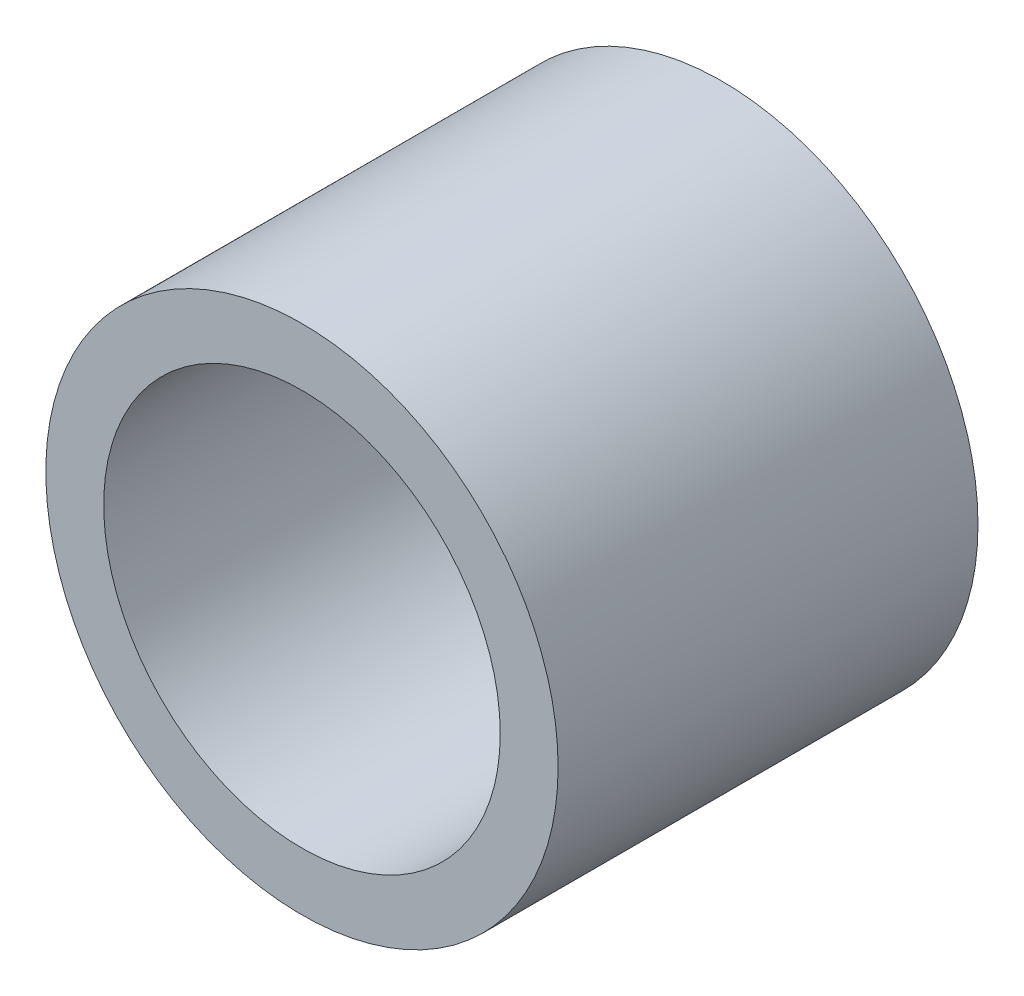
ISO-10303-21;
HEADER;
FILE_DESCRIPTION(('STEP AP214'),'2;1');
FILE_NAME('part.step','',(''),(''),'','','');
FILE_SCHEMA(('AUTOMOTIVE_DESIGN { 1 0 10303 214 1 1 1 1 }'));
ENDSEC;
DATA;
#1=APPLICATION_CONTEXT('core data for automotive mechanical design processes');
#2=APPLICATION_PROTOCOL_DEFINITION('international standard','automotive_design',2000,#1);
#3=PRODUCT_CONTEXT('',#1,'mechanical');
#4=PRODUCT('Part','Part','',(#3));
#5=PRODUCT_RELATED_PRODUCT_CATEGORY('part','',(#4));
#6=PRODUCT_DEFINITION_FORMATION('','',#4);
#7=PRODUCT_DEFINITION_CONTEXT('part definition',#1,'design');
#8=PRODUCT_DEFINITION('design','',#6,#7);
#9=PRODUCT_DEFINITION_SHAPE('','',#8);
#10=(LENGTH_UNIT() NAMED_UNIT(*) SI_UNIT(.MILLI.,.METRE.));
#11=(NAMED_UNIT(*) PLANE_ANGLE_UNIT() SI_UNIT($,.RADIAN.));
#12=(NAMED_UNIT(*) SI_UNIT($,.STERADIAN.) SOLID_ANGLE_UNIT());
#13=UNCERTAINTY_MEASURE_WITH_UNIT(LENGTH_MEASURE(1.E-05),#10,'distance_accuracy_value','');
#14=(GEOMETRIC_REPRESENTATION_CONTEXT(3) GLOBAL_UNCERTAINTY_ASSIGNED_CONTEXT((#13)) GLOBAL_UNIT_ASSIGNED_CONTEXT((#10,
#11,#12)) REPRESENTATION_CONTEXT('',''));
#15=CARTESIAN_POINT('',(0.,0.,0.));
#16=DIRECTION('',(0.,0.,1.));
#17=DIRECTION('',(1.,0.,0.));
#18=AXIS2_PLACEMENT_3D('',#15,#16,#17);
#19=CARTESIAN_POINT('',(-10.98,0.,0.));
#20=DIRECTION('',(0.,0.,-1.));
#21=DIRECTION('',(-1.,0.,0.));
#22=AXIS2_PLACEMENT_3D('',#19,#20,#21);
#23=PLANE('',#22);
#24=CARTESIAN_POINT('',(0.,0.,0.));
#25=DIRECTION('',(0.,0.,1.));
#26=DIRECTION('',(1.,0.,0.));
#27=AXIS2_PLACEMENT_3D('',#24,#25,#26);
#28=CIRCLE('',#27,8.5);
#29=CARTESIAN_POINT('',(8.5,0.,0.));
#30=VERTEX_POINT('',#29);
#31=EDGE_CURVE('E10',#30,#30,#28,.T.);
#32=ORIENTED_EDGE('',*,*,#31,.F.);
#33=EDGE_LOOP('',(#32));
#34=FACE_BOUND('',#33,.T.);
#35=CARTESIAN_POINT('',(0.,0.,0.));
#36=DIRECTION('',(0.,0.,1.));
#37=DIRECTION('',(1.,0.,0.));
#38=AXIS2_PLACEMENT_3D('',#35,#36,#37);
#39=CIRCLE('',#38,10.98);
#40=CARTESIAN_POINT('',(10.98,0.,0.));
#41=VERTEX_POINT('',#40);
#42=EDGE_CURVE('E60',#41,#41,#39,.T.);
#43=ORIENTED_EDGE('',*,*,#42,.T.);
#44=EDGE_LOOP('',(#43));
#45=FACE_BOUND('',#44,.T.);
#46=ADVANCED_FACE('F43',(#34,#45),#23,.F.);
#47=CARTESIAN_POINT('',(0.,0.,0.));
#48=DIRECTION('',(0.,0.,1.));
#49=DIRECTION('',(1.,0.,0.));
#50=AXIS2_PLACEMENT_3D('',#47,#48,#49);
#51=CYLINDRICAL_SURFACE('',#50,8.5);
#52=CARTESIAN_POINT('',(0.,0.,-18.));
#53=DIRECTION('',(0.,0.,1.));
#54=DIRECTION('',(1.,0.,0.));
#55=AXIS2_PLACEMENT_3D('',#52,#53,#54);
#56=CIRCLE('',#55,8.5);
#57=CARTESIAN_POINT('',(8.5,0.,-18.));
#58=VERTEX_POINT('',#57);
#59=EDGE_CURVE('E50',#58,#58,#56,.T.);
#60=ORIENTED_EDGE('',*,*,#59,.F.);
#61=EDGE_LOOP('',(#60));
#62=FACE_BOUND('',#61,.T.);
#63=ORIENTED_EDGE('',*,*,#31,.T.);
#64=EDGE_LOOP('',(#63));
#65=FACE_BOUND('',#64,.T.);
#66=ADVANCED_FACE('F76',(#62,#65),#51,.F.);
#67=CARTESIAN_POINT('',(-8.5,0.,-18.));
#68=DIRECTION('',(0.,0.,1.));
#69=DIRECTION('',(1.,0.,0.));
#70=AXIS2_PLACEMENT_3D('',#67,#68,#69);
#71=PLANE('',#70);
#72=CARTESIAN_POINT('',(0.,0.,-18.));
#73=DIRECTION('',(0.,0.,1.));
#74=DIRECTION('',(1.,0.,0.));
#75=AXIS2_PLACEMENT_3D('',#72,#73,#74);
#76=CIRCLE('',#75,10.98);
#77=CARTESIAN_POINT('',(10.98,0.,-18.));
#78=VERTEX_POINT('',#77);
#79=EDGE_CURVE('E55',#78,#78,#76,.T.);
#80=ORIENTED_EDGE('',*,*,#79,.F.);
#81=EDGE_LOOP('',(#80));
#82=FACE_BOUND('',#81,.T.);
#83=ORIENTED_EDGE('',*,*,#59,.T.);
#84=EDGE_LOOP('',(#83));
#85=FACE_BOUND('',#84,.T.);
#86=ADVANCED_FACE('F71',(#82,#85),#71,.F.);
#87=CARTESIAN_POINT('',(0.,0.,0.));
#88=DIRECTION('',(0.,0.,1.));
#89=DIRECTION('',(1.,0.,0.));
#90=AXIS2_PLACEMENT_3D('',#87,#88,#89);
#91=CYLINDRICAL_SURFACE('',#90,10.98);
#92=ORIENTED_EDGE('',*,*,#42,.F.);
#93=EDGE_LOOP('',(#92));
#94=FACE_BOUND('',#93,.T.);
#95=ORIENTED_EDGE('',*,*,#79,.T.);
#96=EDGE_LOOP('',(#95));
#97=FACE_BOUND('',#96,.T.);
#98=ADVANCED_FACE('F68',(#94,#97),#91,.T.);
#99=CLOSED_SHELL('',(#46,#66,#86,#98));
#100=MANIFOLD_SOLID_BREP('B2',#99);
#101=ADVANCED_BREP_SHAPE_REPRESENTATION('',(#18,#100),#14);
#102=SHAPE_DEFINITION_REPRESENTATION(#9,#101);
ENDSEC;
END-ISO-10303-21;
